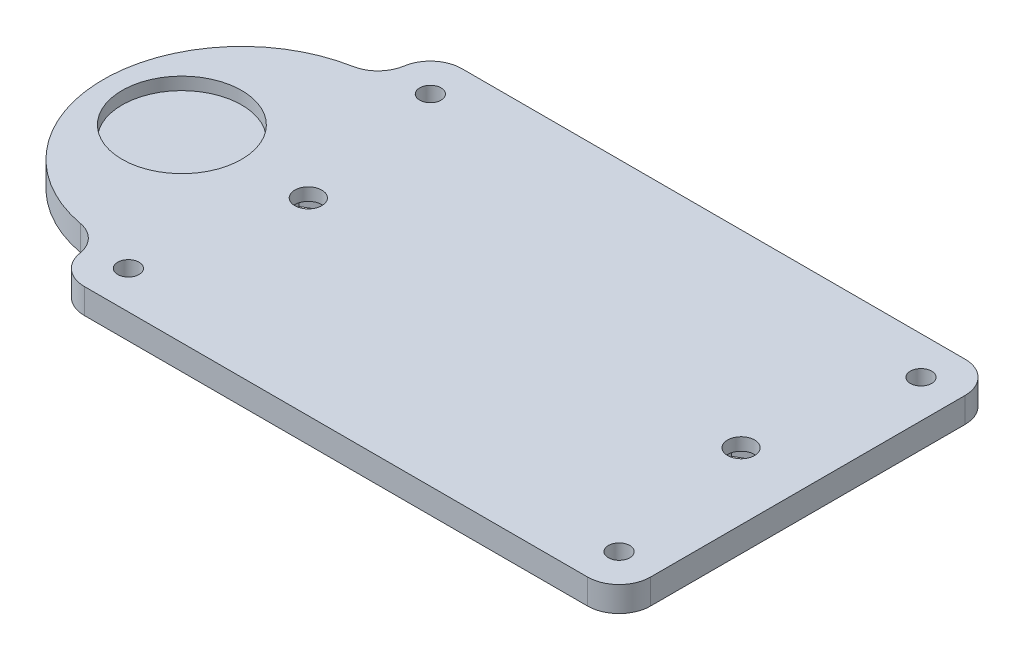
ISO-10303-21;
HEADER;
FILE_DESCRIPTION(('STEP AP214'),'2;1');
FILE_NAME('part.step','',(''),(''),'','','');
FILE_SCHEMA(('AUTOMOTIVE_DESIGN { 1 0 10303 214 1 1 1 1 }'));
ENDSEC;
DATA;
#1=APPLICATION_CONTEXT('core data for automotive mechanical design processes');
#2=APPLICATION_PROTOCOL_DEFINITION('international standard','automotive_design',2000,#1);
#3=PRODUCT_CONTEXT('',#1,'mechanical');
#4=PRODUCT('Part','Part','',(#3));
#5=PRODUCT_RELATED_PRODUCT_CATEGORY('part','',(#4));
#6=PRODUCT_DEFINITION_FORMATION('','',#4);
#7=PRODUCT_DEFINITION_CONTEXT('part definition',#1,'design');
#8=PRODUCT_DEFINITION('design','',#6,#7);
#9=PRODUCT_DEFINITION_SHAPE('','',#8);
#10=(LENGTH_UNIT() NAMED_UNIT(*) SI_UNIT(.MILLI.,.METRE.));
#11=(NAMED_UNIT(*) PLANE_ANGLE_UNIT() SI_UNIT($,.RADIAN.));
#12=(NAMED_UNIT(*) SI_UNIT($,.STERADIAN.) SOLID_ANGLE_UNIT());
#13=UNCERTAINTY_MEASURE_WITH_UNIT(LENGTH_MEASURE(1.E-05),#10,'distance_accuracy_value','');
#14=(GEOMETRIC_REPRESENTATION_CONTEXT(3) GLOBAL_UNCERTAINTY_ASSIGNED_CONTEXT((#13)) GLOBAL_UNIT_ASSIGNED_CONTEXT((#10,
#11,#12)) REPRESENTATION_CONTEXT('',''));
#15=CARTESIAN_POINT('',(0.,0.,0.));
#16=DIRECTION('',(0.,0.,1.));
#17=DIRECTION('',(1.,0.,0.));
#18=AXIS2_PLACEMENT_3D('',#15,#16,#17);
#19=CARTESIAN_POINT('',(34.4,0.,0.));
#20=DIRECTION('',(0.,1.,0.));
#21=DIRECTION('',(0.,0.,1.));
#22=AXIS2_PLACEMENT_3D('',#19,#20,#21);
#23=CYLINDRICAL_SURFACE('',#22,2.15);
#24=CARTESIAN_POINT('',(34.4,4.,0.));
#25=DIRECTION('',(0.,1.,0.));
#26=DIRECTION('',(0.,0.,1.));
#27=AXIS2_PLACEMENT_3D('',#24,#25,#26);
#28=CIRCLE('',#27,2.15);
#29=CARTESIAN_POINT('',(34.4,4.,2.15));
#30=VERTEX_POINT('',#29);
#31=EDGE_CURVE('E334',#30,#30,#28,.T.);
#32=ORIENTED_EDGE('',*,*,#31,.T.);
#33=EDGE_LOOP('',(#32));
#34=FACE_BOUND('',#33,.T.);
#35=CARTESIAN_POINT('',(34.4,2.,0.));
#36=DIRECTION('',(0.,-1.,0.));
#37=DIRECTION('',(0.,0.,-1.));
#38=AXIS2_PLACEMENT_3D('',#35,#36,#37);
#39=CIRCLE('',#38,2.15);
#40=CARTESIAN_POINT('',(34.4,2.,-2.15));
#41=VERTEX_POINT('',#40);
#42=EDGE_CURVE('E339',#41,#41,#39,.F.);
#43=ORIENTED_EDGE('',*,*,#42,.F.);
#44=EDGE_LOOP('',(#43));
#45=FACE_BOUND('',#44,.T.);
#46=ADVANCED_FACE('F38',(#34,#45),#23,.F.);
#47=CARTESIAN_POINT('',(-34.4,0.,0.));
#48=DIRECTION('',(0.,1.,0.));
#49=DIRECTION('',(0.,0.,1.));
#50=AXIS2_PLACEMENT_3D('',#47,#48,#49);
#51=CYLINDRICAL_SURFACE('',#50,2.15);
#52=CARTESIAN_POINT('',(-34.4,4.,0.));
#53=DIRECTION('',(0.,1.,0.));
#54=DIRECTION('',(0.,0.,1.));
#55=AXIS2_PLACEMENT_3D('',#52,#53,#54);
#56=CIRCLE('',#55,2.15);
#57=CARTESIAN_POINT('',(-34.4,4.,2.15));
#58=VERTEX_POINT('',#57);
#59=EDGE_CURVE('E338',#58,#58,#56,.T.);
#60=ORIENTED_EDGE('',*,*,#59,.T.);
#61=EDGE_LOOP('',(#60));
#62=FACE_BOUND('',#61,.T.);
#63=CARTESIAN_POINT('',(-34.4,2.,0.));
#64=DIRECTION('',(0.,-1.,0.));
#65=DIRECTION('',(0.,0.,-1.));
#66=AXIS2_PLACEMENT_3D('',#63,#64,#65);
#67=CIRCLE('',#66,2.15);
#68=CARTESIAN_POINT('',(-34.4,2.,-2.15));
#69=VERTEX_POINT('',#68);
#70=EDGE_CURVE('E256',#69,#69,#67,.F.);
#71=ORIENTED_EDGE('',*,*,#70,.F.);
#72=EDGE_LOOP('',(#71));
#73=FACE_BOUND('',#72,.T.);
#74=ADVANCED_FACE('F539',(#62,#73),#51,.F.);
#75=CARTESIAN_POINT('',(-45.,4.,30.));
#76=DIRECTION('',(0.,0.,-1.));
#77=DIRECTION('',(-1.,0.,0.));
#78=AXIS2_PLACEMENT_3D('',#75,#76,#77);
#79=PLANE('',#78);
#80=DIRECTION('',(1.,0.,0.));
#81=VECTOR('',#80,1.);
#82=CARTESIAN_POINT('',(-45.,0.,30.));
#83=LINE('',#82,#81);
#84=CARTESIAN_POINT('',(-40.,0.,30.));
#85=VERTEX_POINT('',#84);
#86=CARTESIAN_POINT('',(40.,0.,30.));
#87=VERTEX_POINT('',#86);
#88=EDGE_CURVE('E372',#85,#87,#83,.T.);
#89=ORIENTED_EDGE('',*,*,#88,.T.);
#90=DIRECTION('',(0.,-1.,0.));
#91=VECTOR('',#90,1.);
#92=CARTESIAN_POINT('',(40.,4.,30.));
#93=LINE('',#92,#91);
#94=CARTESIAN_POINT('',(40.,4.,30.));
#95=VERTEX_POINT('',#94);
#96=EDGE_CURVE('E448',#87,#95,#93,.F.);
#97=ORIENTED_EDGE('',*,*,#96,.T.);
#98=DIRECTION('',(1.,0.,0.));
#99=VECTOR('',#98,1.);
#100=CARTESIAN_POINT('',(-45.,4.,30.));
#101=LINE('',#100,#99);
#102=CARTESIAN_POINT('',(-40.,4.,30.));
#103=VERTEX_POINT('',#102);
#104=EDGE_CURVE('E376',#103,#95,#101,.T.);
#105=ORIENTED_EDGE('',*,*,#104,.F.);
#106=DIRECTION('',(0.,-1.,0.));
#107=VECTOR('',#106,1.);
#108=CARTESIAN_POINT('',(-40.,4.,30.));
#109=LINE('',#108,#107);
#110=EDGE_CURVE('E444',#103,#85,#109,.T.);
#111=ORIENTED_EDGE('',*,*,#110,.T.);
#112=EDGE_LOOP('',(#89,#97,#105,#111));
#113=FACE_BOUND('',#112,.T.);
#114=ADVANCED_FACE('F545',(#113),#79,.F.);
#115=CARTESIAN_POINT('',(45.,4.,-30.));
#116=DIRECTION('',(-1.,0.,0.));
#117=DIRECTION('',(0.,0.,1.));
#118=AXIS2_PLACEMENT_3D('',#115,#116,#117);
#119=PLANE('',#118);
#120=DIRECTION('',(0.,0.,-1.));
#121=VECTOR('',#120,1.);
#122=CARTESIAN_POINT('',(45.,0.,-30.));
#123=LINE('',#122,#121);
#124=CARTESIAN_POINT('',(45.,0.,25.));
#125=VERTEX_POINT('',#124);
#126=CARTESIAN_POINT('',(45.,0.,-25.));
#127=VERTEX_POINT('',#126);
#128=EDGE_CURVE('E393',#125,#127,#123,.T.);
#129=ORIENTED_EDGE('',*,*,#128,.T.);
#130=DIRECTION('',(0.,-1.,0.));
#131=VECTOR('',#130,1.);
#132=CARTESIAN_POINT('',(45.,4.,-25.));
#133=LINE('',#132,#131);
#134=CARTESIAN_POINT('',(45.,4.,-25.));
#135=VERTEX_POINT('',#134);
#136=EDGE_CURVE('E428',#127,#135,#133,.F.);
#137=ORIENTED_EDGE('',*,*,#136,.T.);
#138=DIRECTION('',(0.,0.,-1.));
#139=VECTOR('',#138,1.);
#140=CARTESIAN_POINT('',(45.,4.,-30.));
#141=LINE('',#140,#139);
#142=CARTESIAN_POINT('',(45.,4.,25.));
#143=VERTEX_POINT('',#142);
#144=EDGE_CURVE('E380',#143,#135,#141,.T.);
#145=ORIENTED_EDGE('',*,*,#144,.F.);
#146=DIRECTION('',(0.,-1.,0.));
#147=VECTOR('',#146,1.);
#148=CARTESIAN_POINT('',(45.,4.,25.));
#149=LINE('',#148,#147);
#150=EDGE_CURVE('E424',#143,#125,#149,.T.);
#151=ORIENTED_EDGE('',*,*,#150,.T.);
#152=EDGE_LOOP('',(#129,#137,#145,#151));
#153=FACE_BOUND('',#152,.T.);
#154=ADVANCED_FACE('F828',(#153),#119,.F.);
#155=CARTESIAN_POINT('',(-45.,4.,-30.));
#156=DIRECTION('',(0.,0.,1.));
#157=DIRECTION('',(1.,0.,0.));
#158=AXIS2_PLACEMENT_3D('',#155,#156,#157);
#159=PLANE('',#158);
#160=DIRECTION('',(-1.,0.,0.));
#161=VECTOR('',#160,1.);
#162=CARTESIAN_POINT('',(-45.,4.,-30.));
#163=LINE('',#162,#161);
#164=CARTESIAN_POINT('',(40.,4.,-30.));
#165=VERTEX_POINT('',#164);
#166=CARTESIAN_POINT('',(-40.,4.,-30.));
#167=VERTEX_POINT('',#166);
#168=EDGE_CURVE('E385',#165,#167,#163,.T.);
#169=ORIENTED_EDGE('',*,*,#168,.F.);
#170=DIRECTION('',(0.,-1.,0.));
#171=VECTOR('',#170,1.);
#172=CARTESIAN_POINT('',(40.,4.,-30.));
#173=LINE('',#172,#171);
#174=CARTESIAN_POINT('',(40.,0.,-30.));
#175=VERTEX_POINT('',#174);
#176=EDGE_CURVE('E408',#165,#175,#173,.T.);
#177=ORIENTED_EDGE('',*,*,#176,.T.);
#178=DIRECTION('',(-1.,0.,0.));
#179=VECTOR('',#178,1.);
#180=CARTESIAN_POINT('',(-45.,0.,-30.));
#181=LINE('',#180,#179);
#182=CARTESIAN_POINT('',(-40.,0.,-30.));
#183=VERTEX_POINT('',#182);
#184=EDGE_CURVE('E381',#175,#183,#181,.T.);
#185=ORIENTED_EDGE('',*,*,#184,.T.);
#186=DIRECTION('',(0.,-1.,0.));
#187=VECTOR('',#186,1.);
#188=CARTESIAN_POINT('',(-40.,4.,-30.));
#189=LINE('',#188,#187);
#190=EDGE_CURVE('E389',#183,#167,#189,.F.);
#191=ORIENTED_EDGE('',*,*,#190,.T.);
#192=EDGE_LOOP('',(#169,#177,#185,#191));
#193=FACE_BOUND('',#192,.T.);
#194=ADVANCED_FACE('F508',(#193),#159,.F.);
#195=CARTESIAN_POINT('',(0.,4.,0.));
#196=DIRECTION('',(0.,1.,0.));
#197=DIRECTION('',(0.,0.,1.));
#198=AXIS2_PLACEMENT_3D('',#195,#196,#197);
#199=PLANE('',#198);
#200=CARTESIAN_POINT('',(-54.5,4.,0.));
#201=DIRECTION('',(0.,1.,0.));
#202=DIRECTION('',(0.,0.,1.));
#203=AXIS2_PLACEMENT_3D('',#200,#201,#202);
#204=CIRCLE('',#203,9.5);
#205=CARTESIAN_POINT('',(-54.5,4.,9.5));
#206=VERTEX_POINT('',#205);
#207=EDGE_CURVE('E495',#206,#206,#204,.T.);
#208=ORIENTED_EDGE('',*,*,#207,.F.);
#209=EDGE_LOOP('',(#208));
#210=FACE_BOUND('',#209,.T.);
#211=CARTESIAN_POINT('',(-39.,4.,24.));
#212=DIRECTION('',(0.,1.,0.));
#213=DIRECTION('',(0.,0.,1.));
#214=AXIS2_PLACEMENT_3D('',#211,#212,#213);
#215=CIRCLE('',#214,1.7);
#216=CARTESIAN_POINT('',(-39.,4.,25.7));
#217=VERTEX_POINT('',#216);
#218=EDGE_CURVE('E345',#217,#217,#215,.T.);
#219=ORIENTED_EDGE('',*,*,#218,.F.);
#220=EDGE_LOOP('',(#219));
#221=FACE_BOUND('',#220,.T.);
#222=CARTESIAN_POINT('',(39.,4.,24.));
#223=DIRECTION('',(0.,1.,0.));
#224=DIRECTION('',(0.,0.,1.));
#225=AXIS2_PLACEMENT_3D('',#222,#223,#224);
#226=CIRCLE('',#225,1.7);
#227=CARTESIAN_POINT('',(39.,4.,25.7));
#228=VERTEX_POINT('',#227);
#229=EDGE_CURVE('E353',#228,#228,#226,.T.);
#230=ORIENTED_EDGE('',*,*,#229,.F.);
#231=EDGE_LOOP('',(#230));
#232=FACE_BOUND('',#231,.T.);
#233=CARTESIAN_POINT('',(39.,4.,-24.));
#234=DIRECTION('',(0.,1.,0.));
#235=DIRECTION('',(0.,0.,1.));
#236=AXIS2_PLACEMENT_3D('',#233,#234,#235);
#237=CIRCLE('',#236,1.7);
#238=CARTESIAN_POINT('',(39.,4.,-22.3));
#239=VERTEX_POINT('',#238);
#240=EDGE_CURVE('E361',#239,#239,#237,.T.);
#241=ORIENTED_EDGE('',*,*,#240,.F.);
#242=EDGE_LOOP('',(#241));
#243=FACE_BOUND('',#242,.T.);
#244=ORIENTED_EDGE('',*,*,#59,.F.);
#245=EDGE_LOOP('',(#244));
#246=FACE_BOUND('',#245,.T.);
#247=ORIENTED_EDGE('',*,*,#31,.F.);
#248=EDGE_LOOP('',(#247));
#249=FACE_BOUND('',#248,.T.);
#250=CARTESIAN_POINT('',(-39.,4.,-24.));
#251=DIRECTION('',(0.,1.,0.));
#252=DIRECTION('',(0.,0.,1.));
#253=AXIS2_PLACEMENT_3D('',#250,#251,#252);
#254=CIRCLE('',#253,1.7);
#255=CARTESIAN_POINT('',(-39.,4.,-22.3));
#256=VERTEX_POINT('',#255);
#257=EDGE_CURVE('E344',#256,#256,#254,.T.);
#258=ORIENTED_EDGE('',*,*,#257,.F.);
#259=EDGE_LOOP('',(#258));
#260=FACE_BOUND('',#259,.T.);
#261=ORIENTED_EDGE('',*,*,#144,.T.);
#262=CARTESIAN_POINT('',(40.,4.,-25.));
#263=DIRECTION('',(0.,1.,0.));
#264=DIRECTION('',(0.,0.,1.));
#265=AXIS2_PLACEMENT_3D('',#262,#263,#264);
#266=CIRCLE('',#265,5.);
#267=EDGE_CURVE('E441',#135,#165,#266,.T.);
#268=ORIENTED_EDGE('',*,*,#267,.T.);
#269=ORIENTED_EDGE('',*,*,#168,.T.);
#270=CARTESIAN_POINT('',(-40.,4.,-25.));
#271=DIRECTION('',(0.,1.,0.));
#272=DIRECTION('',(0.,0.,1.));
#273=AXIS2_PLACEMENT_3D('',#270,#271,#272);
#274=CIRCLE('',#273,5.);
#275=CARTESIAN_POINT('',(-44.9391281899624,4.,-25.7778256379925));
#276=VERTEX_POINT('',#275);
#277=EDGE_CURVE('E437',#167,#276,#274,.T.);
#278=ORIENTED_EDGE('',*,*,#277,.T.);
#279=CARTESIAN_POINT('',(-49.8782563799249,4.,-26.555651275985));
#280=DIRECTION('',(0.,1.,0.));
#281=DIRECTION('',(0.,0.,1.));
#282=AXIS2_PLACEMENT_3D('',#279,#280,#281);
#283=CIRCLE('',#282,5.);
#284=CARTESIAN_POINT('',(-48.9748755688277,4.,-21.6379380767285));
#285=VERTEX_POINT('',#284);
#286=EDGE_CURVE('E464',#276,#285,#283,.F.);
#287=ORIENTED_EDGE('',*,*,#286,.T.);
#288=CARTESIAN_POINT('',(-45.,4.,0.));
#289=DIRECTION('',(0.,1.,0.));
#290=DIRECTION('',(0.,0.,1.));
#291=AXIS2_PLACEMENT_3D('',#288,#289,#290);
#292=CIRCLE('',#291,22.);
#293=CARTESIAN_POINT('',(-48.9748755688277,4.,21.6379380767285));
#294=VERTEX_POINT('',#293);
#295=EDGE_CURVE('E222',#285,#294,#292,.T.);
#296=ORIENTED_EDGE('',*,*,#295,.T.);
#297=CARTESIAN_POINT('',(-49.8782563799249,4.,26.555651275985));
#298=DIRECTION('',(0.,1.,0.));
#299=DIRECTION('',(0.,0.,1.));
#300=AXIS2_PLACEMENT_3D('',#297,#298,#299);
#301=CIRCLE('',#300,5.);
#302=CARTESIAN_POINT('',(-44.9391281899624,4.,25.7778256379925));
#303=VERTEX_POINT('',#302);
#304=EDGE_CURVE('E47',#294,#303,#301,.F.);
#305=ORIENTED_EDGE('',*,*,#304,.T.);
#306=CARTESIAN_POINT('',(-40.,4.,25.));
#307=DIRECTION('',(0.,1.,0.));
#308=DIRECTION('',(0.,0.,1.));
#309=AXIS2_PLACEMENT_3D('',#306,#307,#308);
#310=CIRCLE('',#309,5.);
#311=EDGE_CURVE('E431',#303,#103,#310,.T.);
#312=ORIENTED_EDGE('',*,*,#311,.T.);
#313=ORIENTED_EDGE('',*,*,#104,.T.);
#314=CARTESIAN_POINT('',(40.,4.,25.));
#315=DIRECTION('',(0.,1.,0.));
#316=DIRECTION('',(0.,0.,1.));
#317=AXIS2_PLACEMENT_3D('',#314,#315,#316);
#318=CIRCLE('',#317,5.);
#319=EDGE_CURVE('E434',#95,#143,#318,.T.);
#320=ORIENTED_EDGE('',*,*,#319,.T.);
#321=EDGE_LOOP('',(#261,#268,#269,#278,#287,#296,#305,#312,#313,#320));
#322=FACE_BOUND('',#321,.T.);
#323=ADVANCED_FACE('F486',(#210,#221,#232,#243,#246,#249,#260,#322),#199,.T.);
#324=CARTESIAN_POINT('',(0.,0.,0.));
#325=DIRECTION('',(0.,1.,0.));
#326=DIRECTION('',(0.,0.,1.));
#327=AXIS2_PLACEMENT_3D('',#324,#325,#326);
#328=PLANE('',#327);
#329=DIRECTION('',(-0.866025403784439,0.,0.5));
#330=VECTOR('',#329,1.);
#331=CARTESIAN_POINT('',(-30.825,0.,2.06402721235292));
#332=LINE('',#331,#330);
#333=CARTESIAN_POINT('',(-30.825,0.,2.06402721235291));
#334=VERTEX_POINT('',#333);
#335=CARTESIAN_POINT('',(-34.4,0.,4.12805442470583));
#336=VERTEX_POINT('',#335);
#337=EDGE_CURVE('E238',#334,#336,#332,.T.);
#338=ORIENTED_EDGE('',*,*,#337,.F.);
#339=DIRECTION('',(0.,0.,1.));
#340=VECTOR('',#339,1.);
#341=CARTESIAN_POINT('',(-30.825,0.,-2.06402721235291));
#342=LINE('',#341,#340);
#343=CARTESIAN_POINT('',(-30.825,0.,-2.06402721235291));
#344=VERTEX_POINT('',#343);
#345=EDGE_CURVE('E193',#344,#334,#342,.T.);
#346=ORIENTED_EDGE('',*,*,#345,.F.);
#347=DIRECTION('',(0.866025403784439,0.,0.499999999999999));
#348=VECTOR('',#347,1.);
#349=CARTESIAN_POINT('',(-34.4,0.,-4.12805442470582));
#350=LINE('',#349,#348);
#351=CARTESIAN_POINT('',(-34.4,0.,-4.12805442470582));
#352=VERTEX_POINT('',#351);
#353=EDGE_CURVE('E215',#352,#344,#350,.T.);
#354=ORIENTED_EDGE('',*,*,#353,.F.);
#355=DIRECTION('',(0.866025403784438,0.,-0.500000000000001));
#356=VECTOR('',#355,1.);
#357=CARTESIAN_POINT('',(-37.975,0.,-2.06402721235291));
#358=LINE('',#357,#356);
#359=CARTESIAN_POINT('',(-37.975,0.,-2.06402721235291));
#360=VERTEX_POINT('',#359);
#361=EDGE_CURVE('E219',#360,#352,#358,.T.);
#362=ORIENTED_EDGE('',*,*,#361,.F.);
#363=DIRECTION('',(0.,0.,-1.));
#364=VECTOR('',#363,1.);
#365=CARTESIAN_POINT('',(-37.975,0.,2.06402721235292));
#366=LINE('',#365,#364);
#367=CARTESIAN_POINT('',(-37.975,0.,2.06402721235292));
#368=VERTEX_POINT('',#367);
#369=EDGE_CURVE('E246',#368,#360,#366,.T.);
#370=ORIENTED_EDGE('',*,*,#369,.F.);
#371=DIRECTION('',(-0.866025403784439,0.,-0.5));
#372=VECTOR('',#371,1.);
#373=CARTESIAN_POINT('',(-34.4,0.,4.12805442470583));
#374=LINE('',#373,#372);
#375=EDGE_CURVE('E242',#336,#368,#374,.T.);
#376=ORIENTED_EDGE('',*,*,#375,.F.);
#377=EDGE_LOOP('',(#338,#346,#354,#362,#370,#376));
#378=FACE_BOUND('',#377,.T.);
#379=DIRECTION('',(-0.866025403784438,0.,0.5));
#380=VECTOR('',#379,1.);
#381=CARTESIAN_POINT('',(37.975,0.,2.06402721235291));
#382=LINE('',#381,#380);
#383=CARTESIAN_POINT('',(37.975,0.,2.06402721235292));
#384=VERTEX_POINT('',#383);
#385=CARTESIAN_POINT('',(34.4,0.,4.12805442470582));
#386=VERTEX_POINT('',#385);
#387=EDGE_CURVE('E297',#384,#386,#382,.T.);
#388=ORIENTED_EDGE('',*,*,#387,.F.);
#389=DIRECTION('',(0.,0.,1.));
#390=VECTOR('',#389,1.);
#391=CARTESIAN_POINT('',(37.975,0.,-2.06402721235292));
#392=LINE('',#391,#390);
#393=CARTESIAN_POINT('',(37.975,0.,-2.06402721235292));
#394=VERTEX_POINT('',#393);
#395=EDGE_CURVE('E294',#394,#384,#392,.T.);
#396=ORIENTED_EDGE('',*,*,#395,.F.);
#397=DIRECTION('',(0.866025403784439,0.,0.5));
#398=VECTOR('',#397,1.);
#399=CARTESIAN_POINT('',(34.4,0.,-4.12805442470582));
#400=LINE('',#399,#398);
#401=CARTESIAN_POINT('',(34.4,0.,-4.12805442470582));
#402=VERTEX_POINT('',#401);
#403=EDGE_CURVE('E273',#402,#394,#400,.T.);
#404=ORIENTED_EDGE('',*,*,#403,.F.);
#405=DIRECTION('',(0.866025403784438,0.,-0.5));
#406=VECTOR('',#405,1.);
#407=CARTESIAN_POINT('',(30.825,0.,-2.06402721235291));
#408=LINE('',#407,#406);
#409=CARTESIAN_POINT('',(30.825,0.,-2.06402721235291));
#410=VERTEX_POINT('',#409);
#411=EDGE_CURVE('E310',#410,#402,#408,.T.);
#412=ORIENTED_EDGE('',*,*,#411,.F.);
#413=DIRECTION('',(0.,0.,-1.));
#414=VECTOR('',#413,1.);
#415=CARTESIAN_POINT('',(30.825,0.,2.06402721235291));
#416=LINE('',#415,#414);
#417=CARTESIAN_POINT('',(30.825,0.,2.06402721235291));
#418=VERTEX_POINT('',#417);
#419=EDGE_CURVE('E306',#418,#410,#416,.T.);
#420=ORIENTED_EDGE('',*,*,#419,.F.);
#421=DIRECTION('',(-0.866025403784439,0.,-0.5));
#422=VECTOR('',#421,1.);
#423=CARTESIAN_POINT('',(34.4,0.,4.12805442470582));
#424=LINE('',#423,#422);
#425=EDGE_CURVE('E302',#386,#418,#424,.T.);
#426=ORIENTED_EDGE('',*,*,#425,.F.);
#427=EDGE_LOOP('',(#388,#396,#404,#412,#420,#426));
#428=FACE_BOUND('',#427,.T.);
#429=CARTESIAN_POINT('',(-39.,0.,24.));
#430=DIRECTION('',(0.,1.,0.));
#431=DIRECTION('',(0.,0.,1.));
#432=AXIS2_PLACEMENT_3D('',#429,#430,#431);
#433=CIRCLE('',#432,1.7);
#434=CARTESIAN_POINT('',(-39.,0.,25.7));
#435=VERTEX_POINT('',#434);
#436=EDGE_CURVE('E340',#435,#435,#433,.T.);
#437=ORIENTED_EDGE('',*,*,#436,.T.);
#438=EDGE_LOOP('',(#437));
#439=FACE_BOUND('',#438,.T.);
#440=CARTESIAN_POINT('',(39.,0.,24.));
#441=DIRECTION('',(0.,1.,0.));
#442=DIRECTION('',(0.,0.,1.));
#443=AXIS2_PLACEMENT_3D('',#440,#441,#442);
#444=CIRCLE('',#443,1.7);
#445=CARTESIAN_POINT('',(39.,0.,25.7));
#446=VERTEX_POINT('',#445);
#447=EDGE_CURVE('E349',#446,#446,#444,.T.);
#448=ORIENTED_EDGE('',*,*,#447,.T.);
#449=EDGE_LOOP('',(#448));
#450=FACE_BOUND('',#449,.T.);
#451=CARTESIAN_POINT('',(39.,0.,-24.));
#452=DIRECTION('',(0.,1.,0.));
#453=DIRECTION('',(0.,0.,1.));
#454=AXIS2_PLACEMENT_3D('',#451,#452,#453);
#455=CIRCLE('',#454,1.7);
#456=CARTESIAN_POINT('',(39.,0.,-22.3));
#457=VERTEX_POINT('',#456);
#458=EDGE_CURVE('E357',#457,#457,#455,.T.);
#459=ORIENTED_EDGE('',*,*,#458,.T.);
#460=EDGE_LOOP('',(#459));
#461=FACE_BOUND('',#460,.T.);
#462=CARTESIAN_POINT('',(-39.,0.,-24.));
#463=DIRECTION('',(0.,1.,0.));
#464=DIRECTION('',(0.,0.,1.));
#465=AXIS2_PLACEMENT_3D('',#462,#463,#464);
#466=CIRCLE('',#465,1.7);
#467=CARTESIAN_POINT('',(-39.,0.,-22.3));
#468=VERTEX_POINT('',#467);
#469=EDGE_CURVE('E368',#468,#468,#466,.T.);
#470=ORIENTED_EDGE('',*,*,#469,.T.);
#471=EDGE_LOOP('',(#470));
#472=FACE_BOUND('',#471,.T.);
#473=ORIENTED_EDGE('',*,*,#184,.F.);
#474=CARTESIAN_POINT('',(40.,0.,-25.));
#475=DIRECTION('',(0.,1.,0.));
#476=DIRECTION('',(0.,0.,1.));
#477=AXIS2_PLACEMENT_3D('',#474,#475,#476);
#478=CIRCLE('',#477,5.);
#479=EDGE_CURVE('E421',#175,#127,#478,.F.);
#480=ORIENTED_EDGE('',*,*,#479,.T.);
#481=ORIENTED_EDGE('',*,*,#128,.F.);
#482=CARTESIAN_POINT('',(40.,0.,25.));
#483=DIRECTION('',(0.,1.,0.));
#484=DIRECTION('',(0.,0.,1.));
#485=AXIS2_PLACEMENT_3D('',#482,#483,#484);
#486=CIRCLE('',#485,5.);
#487=EDGE_CURVE('E415',#125,#87,#486,.F.);
#488=ORIENTED_EDGE('',*,*,#487,.T.);
#489=ORIENTED_EDGE('',*,*,#88,.F.);
#490=CARTESIAN_POINT('',(-40.,0.,25.));
#491=DIRECTION('',(0.,1.,0.));
#492=DIRECTION('',(0.,0.,1.));
#493=AXIS2_PLACEMENT_3D('',#490,#491,#492);
#494=CIRCLE('',#493,5.);
#495=CARTESIAN_POINT('',(-44.9391281899624,0.,25.7778256379925));
#496=VERTEX_POINT('',#495);
#497=EDGE_CURVE('E412',#85,#496,#494,.F.);
#498=ORIENTED_EDGE('',*,*,#497,.T.);
#499=CARTESIAN_POINT('',(-49.8782563799249,0.,26.555651275985));
#500=DIRECTION('',(0.,1.,0.));
#501=DIRECTION('',(0.,0.,1.));
#502=AXIS2_PLACEMENT_3D('',#499,#500,#501);
#503=CIRCLE('',#502,5.);
#504=CARTESIAN_POINT('',(-48.9748755688277,0.,21.6379380767285));
#505=VERTEX_POINT('',#504);
#506=EDGE_CURVE('E11',#496,#505,#503,.T.);
#507=ORIENTED_EDGE('',*,*,#506,.T.);
#508=CARTESIAN_POINT('',(-45.,0.,0.));
#509=DIRECTION('',(0.,1.,0.));
#510=DIRECTION('',(0.,0.,1.));
#511=AXIS2_PLACEMENT_3D('',#508,#509,#510);
#512=CIRCLE('',#511,22.);
#513=CARTESIAN_POINT('',(-48.9748755688277,0.,-21.6379380767285));
#514=VERTEX_POINT('',#513);
#515=EDGE_CURVE('E298',#514,#505,#512,.T.);
#516=ORIENTED_EDGE('',*,*,#515,.F.);
#517=CARTESIAN_POINT('',(-49.8782563799249,0.,-26.555651275985));
#518=DIRECTION('',(0.,1.,0.));
#519=DIRECTION('',(0.,0.,1.));
#520=AXIS2_PLACEMENT_3D('',#517,#518,#519);
#521=CIRCLE('',#520,5.);
#522=CARTESIAN_POINT('',(-44.9391281899624,0.,-25.7778256379925));
#523=VERTEX_POINT('',#522);
#524=EDGE_CURVE('E467',#514,#523,#521,.T.);
#525=ORIENTED_EDGE('',*,*,#524,.T.);
#526=CARTESIAN_POINT('',(-40.,0.,-25.));
#527=DIRECTION('',(0.,1.,0.));
#528=DIRECTION('',(0.,0.,1.));
#529=AXIS2_PLACEMENT_3D('',#526,#527,#528);
#530=CIRCLE('',#529,5.);
#531=EDGE_CURVE('E418',#523,#183,#530,.F.);
#532=ORIENTED_EDGE('',*,*,#531,.T.);
#533=EDGE_LOOP('',(#473,#480,#481,#488,#489,#498,#507,#516,#525,#532));
#534=FACE_BOUND('',#533,.T.);
#535=ADVANCED_FACE('F475',(#378,#428,#439,#450,#461,#472,#534),#328,.F.);
#536=CARTESIAN_POINT('',(-39.,0.,-24.));
#537=DIRECTION('',(0.,1.,0.));
#538=DIRECTION('',(0.,0.,1.));
#539=AXIS2_PLACEMENT_3D('',#536,#537,#538);
#540=CYLINDRICAL_SURFACE('',#539,1.7);
#541=ORIENTED_EDGE('',*,*,#469,.F.);
#542=EDGE_LOOP('',(#541));
#543=FACE_BOUND('',#542,.T.);
#544=ORIENTED_EDGE('',*,*,#257,.T.);
#545=EDGE_LOOP('',(#544));
#546=FACE_BOUND('',#545,.T.);
#547=ADVANCED_FACE('F522',(#543,#546),#540,.F.);
#548=CARTESIAN_POINT('',(39.,0.,-24.));
#549=DIRECTION('',(0.,1.,0.));
#550=DIRECTION('',(0.,0.,1.));
#551=AXIS2_PLACEMENT_3D('',#548,#549,#550);
#552=CYLINDRICAL_SURFACE('',#551,1.7);
#553=ORIENTED_EDGE('',*,*,#458,.F.);
#554=EDGE_LOOP('',(#553));
#555=FACE_BOUND('',#554,.T.);
#556=ORIENTED_EDGE('',*,*,#240,.T.);
#557=EDGE_LOOP('',(#556));
#558=FACE_BOUND('',#557,.T.);
#559=ADVANCED_FACE('F524',(#555,#558),#552,.F.);
#560=CARTESIAN_POINT('',(39.,0.,24.));
#561=DIRECTION('',(0.,1.,0.));
#562=DIRECTION('',(0.,0.,1.));
#563=AXIS2_PLACEMENT_3D('',#560,#561,#562);
#564=CYLINDRICAL_SURFACE('',#563,1.7);
#565=ORIENTED_EDGE('',*,*,#447,.F.);
#566=EDGE_LOOP('',(#565));
#567=FACE_BOUND('',#566,.T.);
#568=ORIENTED_EDGE('',*,*,#229,.T.);
#569=EDGE_LOOP('',(#568));
#570=FACE_BOUND('',#569,.T.);
#571=ADVANCED_FACE('F531',(#567,#570),#564,.F.);
#572=CARTESIAN_POINT('',(-39.,0.,24.));
#573=DIRECTION('',(0.,1.,0.));
#574=DIRECTION('',(0.,0.,1.));
#575=AXIS2_PLACEMENT_3D('',#572,#573,#574);
#576=CYLINDRICAL_SURFACE('',#575,1.7);
#577=ORIENTED_EDGE('',*,*,#436,.F.);
#578=EDGE_LOOP('',(#577));
#579=FACE_BOUND('',#578,.T.);
#580=ORIENTED_EDGE('',*,*,#218,.T.);
#581=EDGE_LOOP('',(#580));
#582=FACE_BOUND('',#581,.T.);
#583=ADVANCED_FACE('F552',(#579,#582),#576,.F.);
#584=CARTESIAN_POINT('',(0.,2.,0.));
#585=DIRECTION('',(0.,-1.,0.));
#586=DIRECTION('',(0.,0.,-1.));
#587=AXIS2_PLACEMENT_3D('',#584,#585,#586);
#588=PLANE('',#587);
#589=DIRECTION('',(0.,0.,1.));
#590=VECTOR('',#589,1.);
#591=CARTESIAN_POINT('',(-30.825,2.,-2.06402721235291));
#592=LINE('',#591,#590);
#593=CARTESIAN_POINT('',(-30.825,2.,-2.06402721235291));
#594=VERTEX_POINT('',#593);
#595=CARTESIAN_POINT('',(-30.825,2.,2.06402721235292));
#596=VERTEX_POINT('',#595);
#597=EDGE_CURVE('E190',#594,#596,#592,.T.);
#598=ORIENTED_EDGE('',*,*,#597,.T.);
#599=DIRECTION('',(-0.866025403784439,0.,0.5));
#600=VECTOR('',#599,1.);
#601=CARTESIAN_POINT('',(-30.825,2.,2.06402721235292));
#602=LINE('',#601,#600);
#603=CARTESIAN_POINT('',(-34.4,2.,4.12805442470583));
#604=VERTEX_POINT('',#603);
#605=EDGE_CURVE('E202',#596,#604,#602,.T.);
#606=ORIENTED_EDGE('',*,*,#605,.T.);
#607=DIRECTION('',(-0.866025403784439,0.,-0.5));
#608=VECTOR('',#607,1.);
#609=CARTESIAN_POINT('',(-34.4,2.,4.12805442470583));
#610=LINE('',#609,#608);
#611=CARTESIAN_POINT('',(-37.975,2.,2.06402721235292));
#612=VERTEX_POINT('',#611);
#613=EDGE_CURVE('E208',#604,#612,#610,.T.);
#614=ORIENTED_EDGE('',*,*,#613,.T.);
#615=DIRECTION('',(0.,0.,-1.));
#616=VECTOR('',#615,1.);
#617=CARTESIAN_POINT('',(-37.975,2.,2.06402721235292));
#618=LINE('',#617,#616);
#619=CARTESIAN_POINT('',(-37.975,2.,-2.06402721235291));
#620=VERTEX_POINT('',#619);
#621=EDGE_CURVE('E227',#612,#620,#618,.T.);
#622=ORIENTED_EDGE('',*,*,#621,.T.);
#623=DIRECTION('',(0.866025403784438,0.,-0.500000000000001));
#624=VECTOR('',#623,1.);
#625=CARTESIAN_POINT('',(-37.975,2.,-2.06402721235291));
#626=LINE('',#625,#624);
#627=CARTESIAN_POINT('',(-34.4,2.,-4.12805442470582));
#628=VERTEX_POINT('',#627);
#629=EDGE_CURVE('E231',#620,#628,#626,.T.);
#630=ORIENTED_EDGE('',*,*,#629,.T.);
#631=DIRECTION('',(0.866025403784439,0.,0.499999999999999));
#632=VECTOR('',#631,1.);
#633=CARTESIAN_POINT('',(-34.4,2.,-4.12805442470582));
#634=LINE('',#633,#632);
#635=EDGE_CURVE('E199',#628,#594,#634,.T.);
#636=ORIENTED_EDGE('',*,*,#635,.T.);
#637=EDGE_LOOP('',(#598,#606,#614,#622,#630,#636));
#638=FACE_BOUND('',#637,.T.);
#639=ORIENTED_EDGE('',*,*,#70,.T.);
#640=EDGE_LOOP('',(#639));
#641=FACE_BOUND('',#640,.T.);
#642=ADVANCED_FACE('F210',(#638,#641),#588,.T.);
#643=CARTESIAN_POINT('',(-30.825,2.,-2.06402721235291));
#644=DIRECTION('',(1.,0.,0.));
#645=DIRECTION('',(0.,0.,-1.));
#646=AXIS2_PLACEMENT_3D('',#643,#644,#645);
#647=PLANE('',#646);
#648=ORIENTED_EDGE('',*,*,#345,.T.);
#649=DIRECTION('',(0.,-1.,0.));
#650=VECTOR('',#649,1.);
#651=CARTESIAN_POINT('',(-30.825,2.,2.06402721235292));
#652=LINE('',#651,#650);
#653=EDGE_CURVE('E186',#596,#334,#652,.T.);
#654=ORIENTED_EDGE('',*,*,#653,.F.);
#655=ORIENTED_EDGE('',*,*,#597,.F.);
#656=DIRECTION('',(0.,-1.,0.));
#657=VECTOR('',#656,1.);
#658=CARTESIAN_POINT('',(-30.825,2.,-2.06402721235291));
#659=LINE('',#658,#657);
#660=EDGE_CURVE('E253',#594,#344,#659,.T.);
#661=ORIENTED_EDGE('',*,*,#660,.T.);
#662=EDGE_LOOP('',(#648,#654,#655,#661));
#663=FACE_BOUND('',#662,.T.);
#664=ADVANCED_FACE('F188',(#663),#647,.F.);
#665=CARTESIAN_POINT('',(-34.4,2.,-4.12805442470582));
#666=DIRECTION('',(0.499999999999999,0.,-0.866025403784439));
#667=DIRECTION('',(-0.866025403784439,0.,-0.499999999999999));
#668=AXIS2_PLACEMENT_3D('',#665,#666,#667);
#669=PLANE('',#668);
#670=ORIENTED_EDGE('',*,*,#353,.T.);
#671=ORIENTED_EDGE('',*,*,#660,.F.);
#672=ORIENTED_EDGE('',*,*,#635,.F.);
#673=DIRECTION('',(0.,-1.,0.));
#674=VECTOR('',#673,1.);
#675=CARTESIAN_POINT('',(-34.4,2.,-4.12805442470582));
#676=LINE('',#675,#674);
#677=EDGE_CURVE('E257',#628,#352,#676,.T.);
#678=ORIENTED_EDGE('',*,*,#677,.T.);
#679=EDGE_LOOP('',(#670,#671,#672,#678));
#680=FACE_BOUND('',#679,.T.);
#681=ADVANCED_FACE('F586',(#680),#669,.F.);
#682=CARTESIAN_POINT('',(-37.975,2.,-2.06402721235291));
#683=DIRECTION('',(-0.500000000000001,0.,-0.866025403784438));
#684=DIRECTION('',(-0.866025403784438,0.,0.500000000000001));
#685=AXIS2_PLACEMENT_3D('',#682,#683,#684);
#686=PLANE('',#685);
#687=ORIENTED_EDGE('',*,*,#361,.T.);
#688=ORIENTED_EDGE('',*,*,#677,.F.);
#689=ORIENTED_EDGE('',*,*,#629,.F.);
#690=DIRECTION('',(0.,-1.,0.));
#691=VECTOR('',#690,1.);
#692=CARTESIAN_POINT('',(-37.975,2.,-2.06402721235291));
#693=LINE('',#692,#691);
#694=EDGE_CURVE('E260',#620,#360,#693,.T.);
#695=ORIENTED_EDGE('',*,*,#694,.T.);
#696=EDGE_LOOP('',(#687,#688,#689,#695));
#697=FACE_BOUND('',#696,.T.);
#698=ADVANCED_FACE('F593',(#697),#686,.F.);
#699=CARTESIAN_POINT('',(-37.975,2.,2.06402721235292));
#700=DIRECTION('',(-1.,0.,0.));
#701=DIRECTION('',(0.,0.,1.));
#702=AXIS2_PLACEMENT_3D('',#699,#700,#701);
#703=PLANE('',#702);
#704=ORIENTED_EDGE('',*,*,#369,.T.);
#705=ORIENTED_EDGE('',*,*,#694,.F.);
#706=ORIENTED_EDGE('',*,*,#621,.F.);
#707=DIRECTION('',(0.,-1.,0.));
#708=VECTOR('',#707,1.);
#709=CARTESIAN_POINT('',(-37.975,2.,2.06402721235292));
#710=LINE('',#709,#708);
#711=EDGE_CURVE('E263',#612,#368,#710,.T.);
#712=ORIENTED_EDGE('',*,*,#711,.T.);
#713=EDGE_LOOP('',(#704,#705,#706,#712));
#714=FACE_BOUND('',#713,.T.);
#715=ADVANCED_FACE('F601',(#714),#703,.F.);
#716=CARTESIAN_POINT('',(-34.4,2.,4.12805442470583));
#717=DIRECTION('',(-0.5,0.,0.866025403784439));
#718=DIRECTION('',(0.866025403784439,0.,0.5));
#719=AXIS2_PLACEMENT_3D('',#716,#717,#718);
#720=PLANE('',#719);
#721=ORIENTED_EDGE('',*,*,#375,.T.);
#722=ORIENTED_EDGE('',*,*,#711,.F.);
#723=ORIENTED_EDGE('',*,*,#613,.F.);
#724=DIRECTION('',(0.,-1.,0.));
#725=VECTOR('',#724,1.);
#726=CARTESIAN_POINT('',(-34.4,2.,4.12805442470583));
#727=LINE('',#726,#725);
#728=EDGE_CURVE('E198',#604,#336,#727,.T.);
#729=ORIENTED_EDGE('',*,*,#728,.T.);
#730=EDGE_LOOP('',(#721,#722,#723,#729));
#731=FACE_BOUND('',#730,.T.);
#732=ADVANCED_FACE('F609',(#731),#720,.F.);
#733=CARTESIAN_POINT('',(-30.825,2.,2.06402721235292));
#734=DIRECTION('',(0.5,0.,0.866025403784439));
#735=DIRECTION('',(0.866025403784439,0.,-0.5));
#736=AXIS2_PLACEMENT_3D('',#733,#734,#735);
#737=PLANE('',#736);
#738=ORIENTED_EDGE('',*,*,#337,.T.);
#739=ORIENTED_EDGE('',*,*,#728,.F.);
#740=ORIENTED_EDGE('',*,*,#605,.F.);
#741=ORIENTED_EDGE('',*,*,#653,.T.);
#742=EDGE_LOOP('',(#738,#739,#740,#741));
#743=FACE_BOUND('',#742,.T.);
#744=ADVANCED_FACE('F203',(#743),#737,.F.);
#745=CARTESIAN_POINT('',(0.,2.,0.));
#746=DIRECTION('',(0.,-1.,0.));
#747=DIRECTION('',(0.,0.,-1.));
#748=AXIS2_PLACEMENT_3D('',#745,#746,#747);
#749=PLANE('',#748);
#750=DIRECTION('',(0.,0.,1.));
#751=VECTOR('',#750,1.);
#752=CARTESIAN_POINT('',(37.975,2.,-2.06402721235292));
#753=LINE('',#752,#751);
#754=CARTESIAN_POINT('',(37.975,2.,-2.06402721235292));
#755=VERTEX_POINT('',#754);
#756=CARTESIAN_POINT('',(37.975,2.,2.06402721235291));
#757=VERTEX_POINT('',#756);
#758=EDGE_CURVE('E268',#755,#757,#753,.T.);
#759=ORIENTED_EDGE('',*,*,#758,.T.);
#760=DIRECTION('',(-0.866025403784438,0.,0.5));
#761=VECTOR('',#760,1.);
#762=CARTESIAN_POINT('',(37.975,2.,2.06402721235291));
#763=LINE('',#762,#761);
#764=CARTESIAN_POINT('',(34.4,2.,4.12805442470582));
#765=VERTEX_POINT('',#764);
#766=EDGE_CURVE('E272',#757,#765,#763,.T.);
#767=ORIENTED_EDGE('',*,*,#766,.T.);
#768=DIRECTION('',(-0.866025403784439,0.,-0.5));
#769=VECTOR('',#768,1.);
#770=CARTESIAN_POINT('',(34.4,2.,4.12805442470582));
#771=LINE('',#770,#769);
#772=CARTESIAN_POINT('',(30.825,2.,2.06402721235291));
#773=VERTEX_POINT('',#772);
#774=EDGE_CURVE('E277',#765,#773,#771,.T.);
#775=ORIENTED_EDGE('',*,*,#774,.T.);
#776=DIRECTION('',(0.,0.,-1.));
#777=VECTOR('',#776,1.);
#778=CARTESIAN_POINT('',(30.825,2.,2.06402721235291));
#779=LINE('',#778,#777);
#780=CARTESIAN_POINT('',(30.825,2.,-2.06402721235291));
#781=VERTEX_POINT('',#780);
#782=EDGE_CURVE('E281',#773,#781,#779,.T.);
#783=ORIENTED_EDGE('',*,*,#782,.T.);
#784=DIRECTION('',(0.866025403784438,0.,-0.5));
#785=VECTOR('',#784,1.);
#786=CARTESIAN_POINT('',(30.825,2.,-2.06402721235291));
#787=LINE('',#786,#785);
#788=CARTESIAN_POINT('',(34.4,2.,-4.12805442470582));
#789=VERTEX_POINT('',#788);
#790=EDGE_CURVE('E285',#781,#789,#787,.T.);
#791=ORIENTED_EDGE('',*,*,#790,.T.);
#792=DIRECTION('',(0.866025403784439,0.,0.5));
#793=VECTOR('',#792,1.);
#794=CARTESIAN_POINT('',(34.4,2.,-4.12805442470582));
#795=LINE('',#794,#793);
#796=EDGE_CURVE('E289',#789,#755,#795,.T.);
#797=ORIENTED_EDGE('',*,*,#796,.T.);
#798=EDGE_LOOP('',(#759,#767,#775,#783,#791,#797));
#799=FACE_BOUND('',#798,.T.);
#800=ORIENTED_EDGE('',*,*,#42,.T.);
#801=EDGE_LOOP('',(#800));
#802=FACE_BOUND('',#801,.T.);
#803=ADVANCED_FACE('F624',(#799,#802),#749,.T.);
#804=CARTESIAN_POINT('',(37.975,2.,-2.06402721235292));
#805=DIRECTION('',(1.,0.,0.));
#806=DIRECTION('',(0.,0.,-1.));
#807=AXIS2_PLACEMENT_3D('',#804,#805,#806);
#808=PLANE('',#807);
#809=ORIENTED_EDGE('',*,*,#395,.T.);
#810=DIRECTION('',(0.,-1.,0.));
#811=VECTOR('',#810,1.);
#812=CARTESIAN_POINT('',(37.975,2.,2.06402721235291));
#813=LINE('',#812,#811);
#814=EDGE_CURVE('E293',#757,#384,#813,.T.);
#815=ORIENTED_EDGE('',*,*,#814,.F.);
#816=ORIENTED_EDGE('',*,*,#758,.F.);
#817=DIRECTION('',(0.,-1.,0.));
#818=VECTOR('',#817,1.);
#819=CARTESIAN_POINT('',(37.975,2.,-2.06402721235292));
#820=LINE('',#819,#818);
#821=EDGE_CURVE('E239',#755,#394,#820,.T.);
#822=ORIENTED_EDGE('',*,*,#821,.T.);
#823=EDGE_LOOP('',(#809,#815,#816,#822));
#824=FACE_BOUND('',#823,.T.);
#825=ADVANCED_FACE('F550',(#824),#808,.F.);
#826=CARTESIAN_POINT('',(34.4,2.,-4.12805442470582));
#827=DIRECTION('',(0.5,0.,-0.866025403784439));
#828=DIRECTION('',(-0.866025403784439,0.,-0.5));
#829=AXIS2_PLACEMENT_3D('',#826,#827,#828);
#830=PLANE('',#829);
#831=ORIENTED_EDGE('',*,*,#403,.T.);
#832=ORIENTED_EDGE('',*,*,#821,.F.);
#833=ORIENTED_EDGE('',*,*,#796,.F.);
#834=DIRECTION('',(0.,-1.,0.));
#835=VECTOR('',#834,1.);
#836=CARTESIAN_POINT('',(34.4,2.,-4.12805442470582));
#837=LINE('',#836,#835);
#838=EDGE_CURVE('E319',#789,#402,#837,.T.);
#839=ORIENTED_EDGE('',*,*,#838,.T.);
#840=EDGE_LOOP('',(#831,#832,#833,#839));
#841=FACE_BOUND('',#840,.T.);
#842=ADVANCED_FACE('F638',(#841),#830,.F.);
#843=CARTESIAN_POINT('',(30.825,2.,-2.06402721235291));
#844=DIRECTION('',(-0.5,0.,-0.866025403784439));
#845=DIRECTION('',(-0.866025403784439,0.,0.5));
#846=AXIS2_PLACEMENT_3D('',#843,#844,#845);
#847=PLANE('',#846);
#848=ORIENTED_EDGE('',*,*,#411,.T.);
#849=ORIENTED_EDGE('',*,*,#838,.F.);
#850=ORIENTED_EDGE('',*,*,#790,.F.);
#851=DIRECTION('',(0.,-1.,0.));
#852=VECTOR('',#851,1.);
#853=CARTESIAN_POINT('',(30.825,2.,-2.06402721235291));
#854=LINE('',#853,#852);
#855=EDGE_CURVE('E322',#781,#410,#854,.T.);
#856=ORIENTED_EDGE('',*,*,#855,.T.);
#857=EDGE_LOOP('',(#848,#849,#850,#856));
#858=FACE_BOUND('',#857,.T.);
#859=ADVANCED_FACE('F645',(#858),#847,.F.);
#860=CARTESIAN_POINT('',(30.825,2.,2.06402721235291));
#861=DIRECTION('',(-1.,0.,0.));
#862=DIRECTION('',(0.,0.,1.));
#863=AXIS2_PLACEMENT_3D('',#860,#861,#862);
#864=PLANE('',#863);
#865=ORIENTED_EDGE('',*,*,#419,.T.);
#866=ORIENTED_EDGE('',*,*,#855,.F.);
#867=ORIENTED_EDGE('',*,*,#782,.F.);
#868=DIRECTION('',(0.,-1.,0.));
#869=VECTOR('',#868,1.);
#870=CARTESIAN_POINT('',(30.825,2.,2.06402721235291));
#871=LINE('',#870,#869);
#872=EDGE_CURVE('E325',#773,#418,#871,.T.);
#873=ORIENTED_EDGE('',*,*,#872,.T.);
#874=EDGE_LOOP('',(#865,#866,#867,#873));
#875=FACE_BOUND('',#874,.T.);
#876=ADVANCED_FACE('F653',(#875),#864,.F.);
#877=CARTESIAN_POINT('',(34.4,2.,4.12805442470582));
#878=DIRECTION('',(-0.5,0.,0.866025403784439));
#879=DIRECTION('',(0.866025403784439,0.,0.5));
#880=AXIS2_PLACEMENT_3D('',#877,#878,#879);
#881=PLANE('',#880);
#882=ORIENTED_EDGE('',*,*,#425,.T.);
#883=ORIENTED_EDGE('',*,*,#872,.F.);
#884=ORIENTED_EDGE('',*,*,#774,.F.);
#885=DIRECTION('',(0.,-1.,0.));
#886=VECTOR('',#885,1.);
#887=CARTESIAN_POINT('',(34.4,2.,4.12805442470582));
#888=LINE('',#887,#886);
#889=EDGE_CURVE('E328',#765,#386,#888,.T.);
#890=ORIENTED_EDGE('',*,*,#889,.T.);
#891=EDGE_LOOP('',(#882,#883,#884,#890));
#892=FACE_BOUND('',#891,.T.);
#893=ADVANCED_FACE('F661',(#892),#881,.F.);
#894=CARTESIAN_POINT('',(37.975,2.,2.06402721235291));
#895=DIRECTION('',(0.5,0.,0.866025403784438));
#896=DIRECTION('',(0.866025403784438,0.,-0.5));
#897=AXIS2_PLACEMENT_3D('',#894,#895,#896);
#898=PLANE('',#897);
#899=ORIENTED_EDGE('',*,*,#387,.T.);
#900=ORIENTED_EDGE('',*,*,#889,.F.);
#901=ORIENTED_EDGE('',*,*,#766,.F.);
#902=ORIENTED_EDGE('',*,*,#814,.T.);
#903=EDGE_LOOP('',(#899,#900,#901,#902));
#904=FACE_BOUND('',#903,.T.);
#905=ADVANCED_FACE('F669',(#904),#898,.F.);
#906=CARTESIAN_POINT('',(-45.,0.,0.));
#907=DIRECTION('',(0.,1.,0.));
#908=DIRECTION('',(0.,0.,1.));
#909=AXIS2_PLACEMENT_3D('',#906,#907,#908);
#910=CYLINDRICAL_SURFACE('',#909,22.);
#911=ORIENTED_EDGE('',*,*,#295,.F.);
#912=DIRECTION('',(0.,1.,0.));
#913=VECTOR('',#912,1.);
#914=CARTESIAN_POINT('',(-48.9748755688277,0.,-21.6379380767285));
#915=LINE('',#914,#913);
#916=EDGE_CURVE('E459',#285,#514,#915,.F.);
#917=ORIENTED_EDGE('',*,*,#916,.T.);
#918=ORIENTED_EDGE('',*,*,#515,.T.);
#919=DIRECTION('',(0.,1.,0.));
#920=VECTOR('',#919,1.);
#921=CARTESIAN_POINT('',(-48.9748755688277,0.,21.6379380767285));
#922=LINE('',#921,#920);
#923=EDGE_CURVE('E455',#505,#294,#922,.T.);
#924=ORIENTED_EDGE('',*,*,#923,.T.);
#925=EDGE_LOOP('',(#911,#917,#918,#924));
#926=FACE_BOUND('',#925,.T.);
#927=ADVANCED_FACE('F488',(#926),#910,.T.);
#928=CARTESIAN_POINT('',(-54.5,2.,0.));
#929=DIRECTION('',(0.,1.,0.));
#930=DIRECTION('',(0.,0.,1.));
#931=AXIS2_PLACEMENT_3D('',#928,#929,#930);
#932=CYLINDRICAL_SURFACE('',#931,9.5);
#933=CARTESIAN_POINT('',(-54.5,2.,0.));
#934=DIRECTION('',(0.,1.,0.));
#935=DIRECTION('',(0.,0.,1.));
#936=AXIS2_PLACEMENT_3D('',#933,#934,#935);
#937=CIRCLE('',#936,9.5);
#938=CARTESIAN_POINT('',(-54.5,2.,9.5));
#939=VERTEX_POINT('',#938);
#940=EDGE_CURVE('E491',#939,#939,#937,.T.);
#941=ORIENTED_EDGE('',*,*,#940,.F.);
#942=EDGE_LOOP('',(#941));
#943=FACE_BOUND('',#942,.T.);
#944=ORIENTED_EDGE('',*,*,#207,.T.);
#945=EDGE_LOOP('',(#944));
#946=FACE_BOUND('',#945,.T.);
#947=ADVANCED_FACE('F504',(#943,#946),#932,.F.);
#948=CARTESIAN_POINT('',(-54.5,2.,0.));
#949=DIRECTION('',(0.,1.,0.));
#950=DIRECTION('',(0.,0.,1.));
#951=AXIS2_PLACEMENT_3D('',#948,#949,#950);
#952=PLANE('',#951);
#953=ORIENTED_EDGE('',*,*,#940,.T.);
#954=EDGE_LOOP('',(#953));
#955=FACE_BOUND('',#954,.T.);
#956=ADVANCED_FACE('F691',(#955),#952,.T.);
#957=CARTESIAN_POINT('',(40.,4.,-25.));
#958=DIRECTION('',(0.,-1.,0.));
#959=DIRECTION('',(0.,0.,-1.));
#960=AXIS2_PLACEMENT_3D('',#957,#958,#959);
#961=CYLINDRICAL_SURFACE('',#960,5.);
#962=ORIENTED_EDGE('',*,*,#267,.F.);
#963=ORIENTED_EDGE('',*,*,#136,.F.);
#964=ORIENTED_EDGE('',*,*,#479,.F.);
#965=ORIENTED_EDGE('',*,*,#176,.F.);
#966=EDGE_LOOP('',(#962,#963,#964,#965));
#967=FACE_BOUND('',#966,.T.);
#968=ADVANCED_FACE('F699',(#967),#961,.T.);
#969=CARTESIAN_POINT('',(-40.,4.,-25.));
#970=DIRECTION('',(0.,-1.,0.));
#971=DIRECTION('',(0.,0.,-1.));
#972=AXIS2_PLACEMENT_3D('',#969,#970,#971);
#973=CYLINDRICAL_SURFACE('',#972,5.);
#974=ORIENTED_EDGE('',*,*,#531,.F.);
#975=DIRECTION('',(0.,-1.,0.));
#976=VECTOR('',#975,1.);
#977=CARTESIAN_POINT('',(-44.9391281899624,4.,-25.7778256379925));
#978=LINE('',#977,#976);
#979=EDGE_CURVE('E451',#523,#276,#978,.F.);
#980=ORIENTED_EDGE('',*,*,#979,.T.);
#981=ORIENTED_EDGE('',*,*,#277,.F.);
#982=ORIENTED_EDGE('',*,*,#190,.F.);
#983=EDGE_LOOP('',(#974,#980,#981,#982));
#984=FACE_BOUND('',#983,.T.);
#985=ADVANCED_FACE('F482',(#984),#973,.T.);
#986=CARTESIAN_POINT('',(40.,4.,25.));
#987=DIRECTION('',(0.,-1.,0.));
#988=DIRECTION('',(0.,0.,-1.));
#989=AXIS2_PLACEMENT_3D('',#986,#987,#988);
#990=CYLINDRICAL_SURFACE('',#989,5.);
#991=ORIENTED_EDGE('',*,*,#319,.F.);
#992=ORIENTED_EDGE('',*,*,#96,.F.);
#993=ORIENTED_EDGE('',*,*,#487,.F.);
#994=ORIENTED_EDGE('',*,*,#150,.F.);
#995=EDGE_LOOP('',(#991,#992,#993,#994));
#996=FACE_BOUND('',#995,.T.);
#997=ADVANCED_FACE('F715',(#996),#990,.T.);
#998=CARTESIAN_POINT('',(-40.,4.,25.));
#999=DIRECTION('',(0.,-1.,0.));
#1000=DIRECTION('',(0.,0.,-1.));
#1001=AXIS2_PLACEMENT_3D('',#998,#999,#1000);
#1002=CYLINDRICAL_SURFACE('',#1001,5.);
#1003=ORIENTED_EDGE('',*,*,#311,.F.);
#1004=DIRECTION('',(0.,-1.,0.));
#1005=VECTOR('',#1004,1.);
#1006=CARTESIAN_POINT('',(-44.9391281899624,4.,25.7778256379925));
#1007=LINE('',#1006,#1005);
#1008=EDGE_CURVE('E54',#303,#496,#1007,.T.);
#1009=ORIENTED_EDGE('',*,*,#1008,.T.);
#1010=ORIENTED_EDGE('',*,*,#497,.F.);
#1011=ORIENTED_EDGE('',*,*,#110,.F.);
#1012=EDGE_LOOP('',(#1003,#1009,#1010,#1011));
#1013=FACE_BOUND('',#1012,.T.);
#1014=ADVANCED_FACE('F722',(#1013),#1002,.T.);
#1015=CARTESIAN_POINT('',(-49.8782563799249,0.,-26.555651275985));
#1016=DIRECTION('',(0.,-1.,0.));
#1017=DIRECTION('',(0.,0.,-1.));
#1018=AXIS2_PLACEMENT_3D('',#1015,#1016,#1017);
#1019=CYLINDRICAL_SURFACE('',#1018,5.);
#1020=ORIENTED_EDGE('',*,*,#524,.F.);
#1021=ORIENTED_EDGE('',*,*,#916,.F.);
#1022=ORIENTED_EDGE('',*,*,#286,.F.);
#1023=ORIENTED_EDGE('',*,*,#979,.F.);
#1024=EDGE_LOOP('',(#1020,#1021,#1022,#1023));
#1025=FACE_BOUND('',#1024,.T.);
#1026=ADVANCED_FACE('F484',(#1025),#1019,.F.);
#1027=CARTESIAN_POINT('',(-49.8782563799249,4.,26.555651275985));
#1028=DIRECTION('',(0.,-1.,0.));
#1029=DIRECTION('',(0.,0.,-1.));
#1030=AXIS2_PLACEMENT_3D('',#1027,#1028,#1029);
#1031=CYLINDRICAL_SURFACE('',#1030,5.);
#1032=ORIENTED_EDGE('',*,*,#506,.F.);
#1033=ORIENTED_EDGE('',*,*,#1008,.F.);
#1034=ORIENTED_EDGE('',*,*,#304,.F.);
#1035=ORIENTED_EDGE('',*,*,#923,.F.);
#1036=EDGE_LOOP('',(#1032,#1033,#1034,#1035));
#1037=FACE_BOUND('',#1036,.T.);
#1038=ADVANCED_FACE('F40',(#1037),#1031,.F.);
#1039=CLOSED_SHELL('',(#46,#74,#114,#154,#194,#323,#535,#547,#559,#571,#583,#642,#664,#681,#698,
#715,#732,#744,#803,#825,#842,#859,#876,#893,#905,#927,#947,#956,#968,#985,#997,#1014,#1026,#1038));
#1040=MANIFOLD_SOLID_BREP('B2',#1039);
#1041=ADVANCED_BREP_SHAPE_REPRESENTATION('',(#18,#1040),#14);
#1042=SHAPE_DEFINITION_REPRESENTATION(#9,#1041);
ENDSEC;
END-ISO-10303-21;
